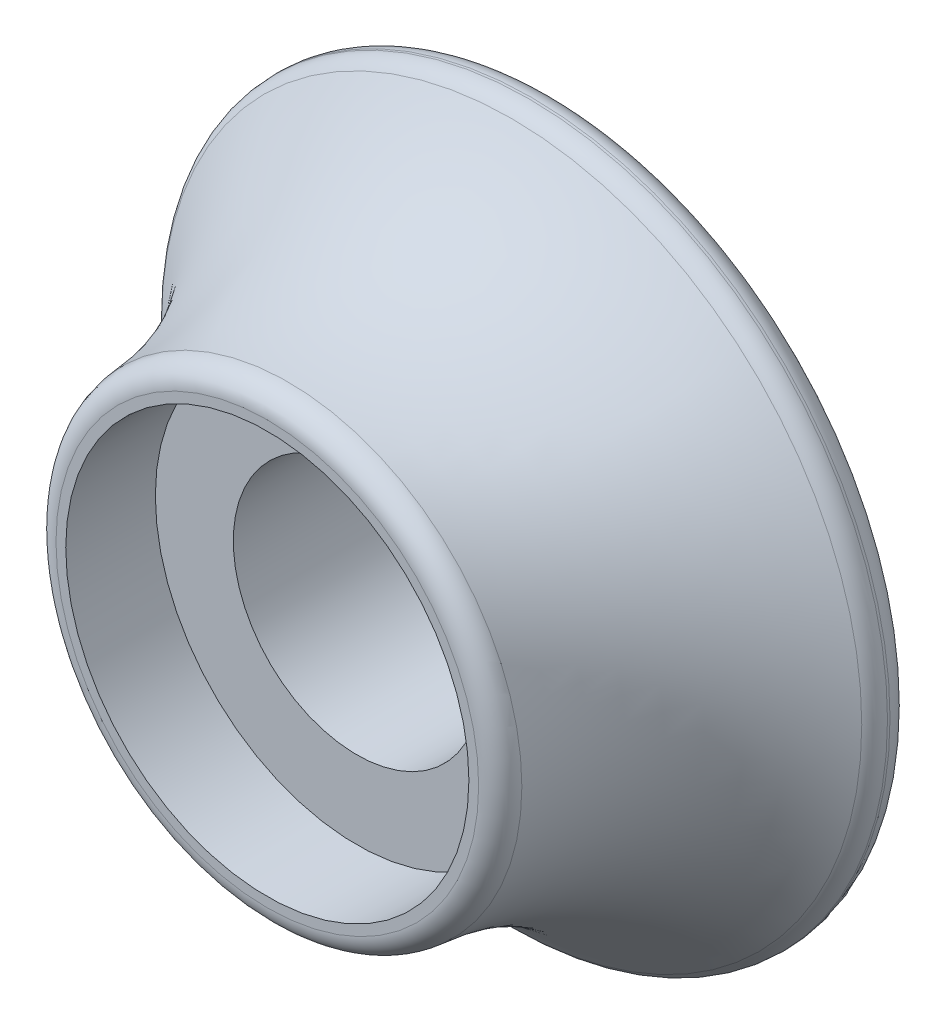
ISO-10303-21;
HEADER;
FILE_DESCRIPTION(('STEP AP214'),'2;1');
FILE_NAME('part.step','',(''),(''),'','','');
FILE_SCHEMA(('AUTOMOTIVE_DESIGN { 1 0 10303 214 1 1 1 1 }'));
ENDSEC;
DATA;
#1=APPLICATION_CONTEXT('core data for automotive mechanical design processes');
#2=APPLICATION_PROTOCOL_DEFINITION('international standard','automotive_design',2000,#1);
#3=PRODUCT_CONTEXT('',#1,'mechanical');
#4=PRODUCT('Part','Part','',(#3));
#5=PRODUCT_RELATED_PRODUCT_CATEGORY('part','',(#4));
#6=PRODUCT_DEFINITION_FORMATION('','',#4);
#7=PRODUCT_DEFINITION_CONTEXT('part definition',#1,'design');
#8=PRODUCT_DEFINITION('design','',#6,#7);
#9=PRODUCT_DEFINITION_SHAPE('','',#8);
#10=(LENGTH_UNIT() NAMED_UNIT(*) SI_UNIT(.MILLI.,.METRE.));
#11=(NAMED_UNIT(*) PLANE_ANGLE_UNIT() SI_UNIT($,.RADIAN.));
#12=(NAMED_UNIT(*) SI_UNIT($,.STERADIAN.) SOLID_ANGLE_UNIT());
#13=UNCERTAINTY_MEASURE_WITH_UNIT(LENGTH_MEASURE(1.E-05),#10,'distance_accuracy_value','');
#14=(GEOMETRIC_REPRESENTATION_CONTEXT(3) GLOBAL_UNCERTAINTY_ASSIGNED_CONTEXT((#13)) GLOBAL_UNIT_ASSIGNED_CONTEXT((#10,
#11,#12)) REPRESENTATION_CONTEXT('',''));
#15=CARTESIAN_POINT('',(0.,0.,0.));
#16=DIRECTION('',(0.,0.,1.));
#17=DIRECTION('',(1.,0.,0.));
#18=AXIS2_PLACEMENT_3D('',#15,#16,#17);
#19=CARTESIAN_POINT('',(0.,0.,20.32));
#20=DIRECTION('',(0.,0.,1.));
#21=DIRECTION('',(1.,0.,0.));
#22=AXIS2_PLACEMENT_3D('',#19,#20,#21);
#23=PLANE('',#22);
#24=CARTESIAN_POINT('',(0.,0.,20.32));
#25=DIRECTION('',(0.,0.,1.));
#26=DIRECTION('',(1.,0.,0.));
#27=AXIS2_PLACEMENT_3D('',#24,#25,#26);
#28=CIRCLE('',#27,14.9794057059808);
#29=CARTESIAN_POINT('',(14.9794057059808,0.,20.32));
#30=VERTEX_POINT('',#29);
#31=EDGE_CURVE('E56',#30,#30,#28,.T.);
#32=ORIENTED_EDGE('',*,*,#31,.T.);
#33=EDGE_LOOP('',(#32));
#34=FACE_BOUND('',#33,.T.);
#35=CARTESIAN_POINT('',(0.,0.,20.32));
#36=DIRECTION('',(0.,0.,1.));
#37=DIRECTION('',(1.,0.,0.));
#38=AXIS2_PLACEMENT_3D('',#35,#36,#37);
#39=CIRCLE('',#38,14.2875);
#40=CARTESIAN_POINT('',(14.2875,0.,20.32));
#41=VERTEX_POINT('',#40);
#42=EDGE_CURVE('E76',#41,#41,#39,.T.);
#43=ORIENTED_EDGE('',*,*,#42,.F.);
#44=EDGE_LOOP('',(#43));
#45=FACE_BOUND('',#44,.T.);
#46=ADVANCED_FACE('F43',(#34,#45),#23,.T.);
#47=CARTESIAN_POINT('',(0.,0.,13.97));
#48=DIRECTION('',(0.,0.,1.));
#49=DIRECTION('',(1.,0.,0.));
#50=AXIS2_PLACEMENT_3D('',#47,#48,#49);
#51=CYLINDRICAL_SURFACE('',#50,14.2875);
#52=CARTESIAN_POINT('',(0.,0.,13.97));
#53=DIRECTION('',(0.,0.,1.));
#54=DIRECTION('',(1.,0.,0.));
#55=AXIS2_PLACEMENT_3D('',#52,#53,#54);
#56=CIRCLE('',#55,14.2875);
#57=CARTESIAN_POINT('',(14.2875,0.,13.97));
#58=VERTEX_POINT('',#57);
#59=EDGE_CURVE('E75',#58,#58,#56,.T.);
#60=ORIENTED_EDGE('',*,*,#59,.F.);
#61=EDGE_LOOP('',(#60));
#62=FACE_BOUND('',#61,.T.);
#63=ORIENTED_EDGE('',*,*,#42,.T.);
#64=EDGE_LOOP('',(#63));
#65=FACE_BOUND('',#64,.T.);
#66=ADVANCED_FACE('F106',(#62,#65),#51,.F.);
#67=CARTESIAN_POINT('',(0.,0.,13.97));
#68=DIRECTION('',(0.,0.,1.));
#69=DIRECTION('',(1.,0.,0.));
#70=AXIS2_PLACEMENT_3D('',#67,#68,#69);
#71=PLANE('',#70);
#72=CARTESIAN_POINT('',(0.,0.,13.97));
#73=DIRECTION('',(0.,0.,1.));
#74=DIRECTION('',(1.,0.,0.));
#75=AXIS2_PLACEMENT_3D('',#72,#73,#74);
#76=CIRCLE('',#75,8.763);
#77=CARTESIAN_POINT('',(8.763,0.,13.97));
#78=VERTEX_POINT('',#77);
#79=EDGE_CURVE('E84',#78,#78,#76,.T.);
#80=ORIENTED_EDGE('',*,*,#79,.F.);
#81=EDGE_LOOP('',(#80));
#82=FACE_BOUND('',#81,.T.);
#83=ORIENTED_EDGE('',*,*,#59,.T.);
#84=EDGE_LOOP('',(#83));
#85=FACE_BOUND('',#84,.T.);
#86=ADVANCED_FACE('F102',(#82,#85),#71,.T.);
#87=CARTESIAN_POINT('',(0.,0.,20.3834549644257));
#88=DIRECTION('',(0.,0.,1.));
#89=DIRECTION('',(1.,0.,0.));
#90=AXIS2_PLACEMENT_3D('',#87,#88,#89);
#91=TOROIDAL_SURFACE('',#90,38.8619099288515,22.352);
#92=CARTESIAN_POINT('',(0.,0.,18.8419797721768));
#93=DIRECTION('',(0.,0.,1.));
#94=DIRECTION('',(1.,0.,0.));
#95=AXIS2_PLACEMENT_3D('',#92,#93,#94);
#96=CIRCLE('',#95,16.5631261451632);
#97=CARTESIAN_POINT('',(16.5631261451632,0.,18.8419797721768));
#98=VERTEX_POINT('',#97);
#99=EDGE_CURVE('E10',#98,#98,#96,.F.);
#100=ORIENTED_EDGE('',*,*,#99,.T.);
#101=EDGE_LOOP('',(#100));
#102=FACE_BOUND('',#101,.T.);
#103=CARTESIAN_POINT('',(0.,0.,3.00044654995341));
#104=DIRECTION('',(0.,0.,1.));
#105=DIRECTION('',(1.,0.,0.));
#106=AXIS2_PLACEMENT_3D('',#103,#104,#105);
#107=CIRCLE('',#106,24.8104714806931);
#108=CARTESIAN_POINT('',(24.8104714806931,0.,3.00044654995341));
#109=VERTEX_POINT('',#108);
#110=EDGE_CURVE('E51',#109,#109,#107,.T.);
#111=ORIENTED_EDGE('',*,*,#110,.T.);
#112=EDGE_LOOP('',(#111));
#113=FACE_BOUND('',#112,.T.);
#114=ADVANCED_FACE('F105',(#102,#113),#91,.F.);
#115=CARTESIAN_POINT('',(0.,0.,0.));
#116=DIRECTION('',(0.,0.,1.));
#117=DIRECTION('',(1.,0.,0.));
#118=AXIS2_PLACEMENT_3D('',#115,#116,#117);
#119=PLANE('',#118);
#120=CARTESIAN_POINT('',(0.,0.,0.));
#121=DIRECTION('',(0.,0.,1.));
#122=DIRECTION('',(1.,0.,0.));
#123=AXIS2_PLACEMENT_3D('',#120,#121,#122);
#124=CIRCLE('',#123,23.8125);
#125=CARTESIAN_POINT('',(23.8125,0.,0.));
#126=VERTEX_POINT('',#125);
#127=EDGE_CURVE('E61',#126,#126,#124,.F.);
#128=ORIENTED_EDGE('',*,*,#127,.T.);
#129=EDGE_LOOP('',(#128));
#130=FACE_BOUND('',#129,.T.);
#131=CARTESIAN_POINT('',(0.,0.,0.));
#132=DIRECTION('',(0.,0.,1.));
#133=DIRECTION('',(1.,0.,0.));
#134=AXIS2_PLACEMENT_3D('',#131,#132,#133);
#135=CIRCLE('',#134,8.763);
#136=CARTESIAN_POINT('',(8.763,0.,0.));
#137=VERTEX_POINT('',#136);
#138=EDGE_CURVE('E80',#137,#137,#135,.T.);
#139=ORIENTED_EDGE('',*,*,#138,.T.);
#140=EDGE_LOOP('',(#139));
#141=FACE_BOUND('',#140,.T.);
#142=ADVANCED_FACE('F92',(#130,#141),#119,.F.);
#143=CARTESIAN_POINT('',(0.,0.,20.32));
#144=DIRECTION('',(0.,0.,-1.));
#145=DIRECTION('',(-1.,0.,0.));
#146=AXIS2_PLACEMENT_3D('',#143,#144,#145);
#147=CYLINDRICAL_SURFACE('',#146,25.4);
#148=CARTESIAN_POINT('',(0.,0.,1.5875));
#149=DIRECTION('',(0.,0.,1.));
#150=DIRECTION('',(1.,0.,0.));
#151=AXIS2_PLACEMENT_3D('',#148,#149,#150);
#152=CIRCLE('',#151,25.4);
#153=CARTESIAN_POINT('',(25.4,0.,1.5875));
#154=VERTEX_POINT('',#153);
#155=EDGE_CURVE('E67',#154,#154,#152,.T.);
#156=ORIENTED_EDGE('',*,*,#155,.T.);
#157=EDGE_LOOP('',(#156));
#158=FACE_BOUND('',#157,.T.);
#159=CARTESIAN_POINT('',(0.,0.,1.76585788415284));
#160=DIRECTION('',(0.,0.,-1.));
#161=DIRECTION('',(-1.,0.,0.));
#162=AXIS2_PLACEMENT_3D('',#159,#160,#161);
#163=CIRCLE('',#162,25.4);
#164=CARTESIAN_POINT('',(-25.4,0.,1.76585788415284));
#165=VERTEX_POINT('',#164);
#166=EDGE_CURVE('E71',#165,#165,#163,.T.);
#167=ORIENTED_EDGE('',*,*,#166,.T.);
#168=EDGE_LOOP('',(#167));
#169=FACE_BOUND('',#168,.T.);
#170=ADVANCED_FACE('F98',(#158,#169),#147,.T.);
#171=CARTESIAN_POINT('',(0.,0.,0.));
#172=DIRECTION('',(0.,0.,1.));
#173=DIRECTION('',(1.,0.,0.));
#174=AXIS2_PLACEMENT_3D('',#171,#172,#173);
#175=CYLINDRICAL_SURFACE('',#174,8.763);
#176=ORIENTED_EDGE('',*,*,#138,.F.);
#177=EDGE_LOOP('',(#176));
#178=FACE_BOUND('',#177,.T.);
#179=ORIENTED_EDGE('',*,*,#79,.T.);
#180=EDGE_LOOP('',(#179));
#181=FACE_BOUND('',#180,.T.);
#182=ADVANCED_FACE('F94',(#178,#181),#175,.F.);
#183=CARTESIAN_POINT('',(0.,0.,1.5875));
#184=DIRECTION('',(0.,0.,1.));
#185=DIRECTION('',(1.,0.,0.));
#186=AXIS2_PLACEMENT_3D('',#183,#184,#185);
#187=TOROIDAL_SURFACE('',#186,23.8125,1.5875);
#188=ORIENTED_EDGE('',*,*,#127,.F.);
#189=EDGE_LOOP('',(#188));
#190=FACE_BOUND('',#189,.T.);
#191=ORIENTED_EDGE('',*,*,#155,.F.);
#192=EDGE_LOOP('',(#191));
#193=FACE_BOUND('',#192,.T.);
#194=ADVANCED_FACE('F97',(#190,#193),#187,.T.);
#195=CARTESIAN_POINT('',(0.,0.,18.7325));
#196=DIRECTION('',(0.,0.,-1.));
#197=DIRECTION('',(-1.,0.,0.));
#198=AXIS2_PLACEMENT_3D('',#195,#196,#197);
#199=TOROIDAL_SURFACE('',#198,14.9794057059808,1.5875);
#200=ORIENTED_EDGE('',*,*,#99,.F.);
#201=EDGE_LOOP('',(#200));
#202=FACE_BOUND('',#201,.T.);
#203=ORIENTED_EDGE('',*,*,#31,.F.);
#204=EDGE_LOOP('',(#203));
#205=FACE_BOUND('',#204,.T.);
#206=ADVANCED_FACE('F129',(#202,#205),#199,.T.);
#207=CARTESIAN_POINT('',(0.,0.,1.76585788415284));
#208=DIRECTION('',(0.,0.,-1.));
#209=DIRECTION('',(-1.,0.,0.));
#210=AXIS2_PLACEMENT_3D('',#207,#208,#209);
#211=TOROIDAL_SURFACE('',#210,23.8125,1.5875);
#212=ORIENTED_EDGE('',*,*,#166,.F.);
#213=EDGE_LOOP('',(#212));
#214=FACE_BOUND('',#213,.T.);
#215=ORIENTED_EDGE('',*,*,#110,.F.);
#216=EDGE_LOOP('',(#215));
#217=FACE_BOUND('',#216,.T.);
#218=ADVANCED_FACE('F45',(#214,#217),#211,.T.);
#219=CLOSED_SHELL('',(#46,#66,#86,#114,#142,#170,#182,#194,#206,#218));
#220=MANIFOLD_SOLID_BREP('B2',#219);
#221=ADVANCED_BREP_SHAPE_REPRESENTATION('',(#18,#220),#14);
#222=SHAPE_DEFINITION_REPRESENTATION(#9,#221);
ENDSEC;
END-ISO-10303-21;
